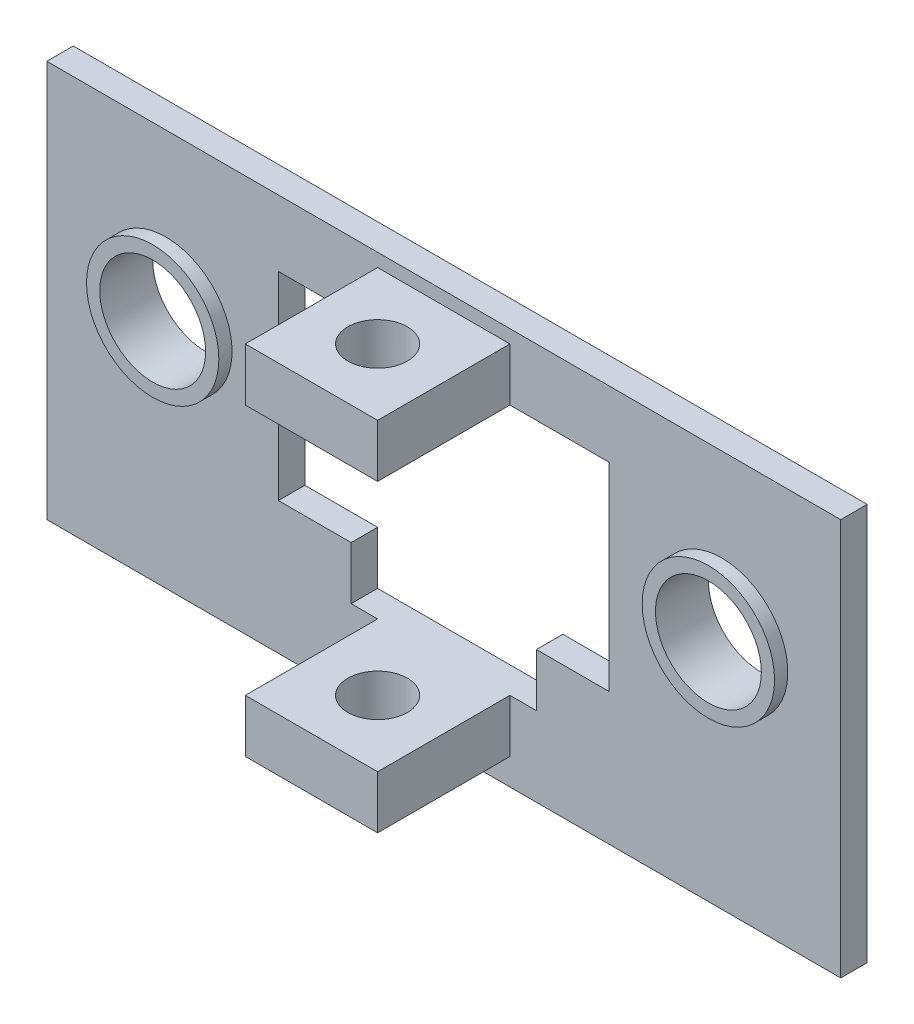
ISO-10303-21;
HEADER;
FILE_DESCRIPTION(('STEP AP214'),'2;1');
FILE_NAME('part.step','',(''),(''),'','','');
FILE_SCHEMA(('AUTOMOTIVE_DESIGN { 1 0 10303 214 1 1 1 1 }'));
ENDSEC;
DATA;
#1=APPLICATION_CONTEXT('core data for automotive mechanical design processes');
#2=APPLICATION_PROTOCOL_DEFINITION('international standard','automotive_design',2000,#1);
#3=PRODUCT_CONTEXT('',#1,'mechanical');
#4=PRODUCT('Part','Part','',(#3));
#5=PRODUCT_RELATED_PRODUCT_CATEGORY('part','',(#4));
#6=PRODUCT_DEFINITION_FORMATION('','',#4);
#7=PRODUCT_DEFINITION_CONTEXT('part definition',#1,'design');
#8=PRODUCT_DEFINITION('design','',#6,#7);
#9=PRODUCT_DEFINITION_SHAPE('','',#8);
#10=(LENGTH_UNIT() NAMED_UNIT(*) SI_UNIT(.MILLI.,.METRE.));
#11=(NAMED_UNIT(*) PLANE_ANGLE_UNIT() SI_UNIT($,.RADIAN.));
#12=(NAMED_UNIT(*) SI_UNIT($,.STERADIAN.) SOLID_ANGLE_UNIT());
#13=UNCERTAINTY_MEASURE_WITH_UNIT(LENGTH_MEASURE(1.E-05),#10,'distance_accuracy_value','');
#14=(GEOMETRIC_REPRESENTATION_CONTEXT(3) GLOBAL_UNCERTAINTY_ASSIGNED_CONTEXT((#13)) GLOBAL_UNIT_ASSIGNED_CONTEXT((#10,
#11,#12)) REPRESENTATION_CONTEXT('',''));
#15=CARTESIAN_POINT('',(0.,0.,0.));
#16=DIRECTION('',(0.,0.,1.));
#17=DIRECTION('',(1.,0.,0.));
#18=AXIS2_PLACEMENT_3D('',#15,#16,#17);
#19=CARTESIAN_POINT('',(12.5,-5.,0.));
#20=DIRECTION('',(0.,-1.,0.));
#21=DIRECTION('',(1.,0.,0.));
#22=AXIS2_PLACEMENT_3D('',#19,#20,#21);
#23=PLANE('',#22);
#24=DIRECTION('',(1.,0.,0.));
#25=VECTOR('',#24,1.);
#26=CARTESIAN_POINT('',(12.5,-5.,2.));
#27=LINE('',#26,#25);
#28=CARTESIAN_POINT('',(-12.5,-5.,2.));
#29=VERTEX_POINT('',#28);
#30=CARTESIAN_POINT('',(-7.,-5.,2.));
#31=VERTEX_POINT('',#30);
#32=EDGE_CURVE('E367',#29,#31,#27,.T.);
#33=ORIENTED_EDGE('',*,*,#32,.T.);
#34=DIRECTION('',(0.,0.,-1.));
#35=VECTOR('',#34,1.);
#36=CARTESIAN_POINT('',(-7.,-5.,0.));
#37=LINE('',#36,#35);
#38=CARTESIAN_POINT('',(-7.,-5.,0.));
#39=VERTEX_POINT('',#38);
#40=EDGE_CURVE('E52',#31,#39,#37,.T.);
#41=ORIENTED_EDGE('',*,*,#40,.T.);
#42=DIRECTION('',(1.,0.,0.));
#43=VECTOR('',#42,1.);
#44=CARTESIAN_POINT('',(12.5,-5.,0.));
#45=LINE('',#44,#43);
#46=CARTESIAN_POINT('',(-12.5,-5.,0.));
#47=VERTEX_POINT('',#46);
#48=EDGE_CURVE('E349',#47,#39,#45,.T.);
#49=ORIENTED_EDGE('',*,*,#48,.F.);
#50=DIRECTION('',(0.,0.,1.));
#51=VECTOR('',#50,1.);
#52=CARTESIAN_POINT('',(-12.5,-5.,0.));
#53=LINE('',#52,#51);
#54=EDGE_CURVE('E383',#47,#29,#53,.T.);
#55=ORIENTED_EDGE('',*,*,#54,.T.);
#56=EDGE_LOOP('',(#33,#41,#49,#55));
#57=FACE_BOUND('',#56,.T.);
#58=ADVANCED_FACE('F43',(#57),#23,.F.);
#59=CARTESIAN_POINT('',(0.,0.,2.));
#60=DIRECTION('',(0.,0.,-1.));
#61=DIRECTION('',(-1.,0.,0.));
#62=AXIS2_PLACEMENT_3D('',#59,#60,#61);
#63=PLANE('',#62);
#64=CARTESIAN_POINT('',(7.,-5.,2.));
#65=VERTEX_POINT('',#64);
#66=CARTESIAN_POINT('',(12.5,-5.,2.));
#67=VERTEX_POINT('',#66);
#68=EDGE_CURVE('E348',#65,#67,#27,.T.);
#69=ORIENTED_EDGE('',*,*,#68,.F.);
#70=DIRECTION('',(0.,1.,0.));
#71=VECTOR('',#70,1.);
#72=CARTESIAN_POINT('',(7.,-5.,2.));
#73=LINE('',#72,#71);
#74=CARTESIAN_POINT('',(7.,-9.,2.));
#75=VERTEX_POINT('',#74);
#76=EDGE_CURVE('E195',#75,#65,#73,.T.);
#77=ORIENTED_EDGE('',*,*,#76,.F.);
#78=DIRECTION('',(1.,0.,0.));
#79=VECTOR('',#78,1.);
#80=CARTESIAN_POINT('',(-7.,-9.,2.));
#81=LINE('',#80,#79);
#82=CARTESIAN_POINT('',(5.,-9.,2.));
#83=VERTEX_POINT('',#82);
#84=EDGE_CURVE('E204',#83,#75,#81,.T.);
#85=ORIENTED_EDGE('',*,*,#84,.F.);
#86=DIRECTION('',(0.,1.,0.));
#87=VECTOR('',#86,1.);
#88=CARTESIAN_POINT('',(5.,-9.,2.));
#89=LINE('',#88,#87);
#90=CARTESIAN_POINT('',(5.,-13.,2.));
#91=VERTEX_POINT('',#90);
#92=EDGE_CURVE('E279',#91,#83,#89,.T.);
#93=ORIENTED_EDGE('',*,*,#92,.F.);
#94=DIRECTION('',(1.,0.,0.));
#95=VECTOR('',#94,1.);
#96=CARTESIAN_POINT('',(-5.,-13.,2.));
#97=LINE('',#96,#95);
#98=CARTESIAN_POINT('',(-5.,-13.,2.));
#99=VERTEX_POINT('',#98);
#100=EDGE_CURVE('E67',#99,#91,#97,.T.);
#101=ORIENTED_EDGE('',*,*,#100,.F.);
#102=DIRECTION('',(0.,-1.,0.));
#103=VECTOR('',#102,1.);
#104=CARTESIAN_POINT('',(-5.,-9.,2.));
#105=LINE('',#104,#103);
#106=CARTESIAN_POINT('',(-5.,-9.,2.));
#107=VERTEX_POINT('',#106);
#108=EDGE_CURVE('E210',#107,#99,#105,.T.);
#109=ORIENTED_EDGE('',*,*,#108,.F.);
#110=CARTESIAN_POINT('',(-7.,-9.,2.));
#111=VERTEX_POINT('',#110);
#112=EDGE_CURVE('E188',#111,#107,#81,.T.);
#113=ORIENTED_EDGE('',*,*,#112,.F.);
#114=DIRECTION('',(0.,-1.,0.));
#115=VECTOR('',#114,1.);
#116=CARTESIAN_POINT('',(-7.,-5.,2.));
#117=LINE('',#116,#115);
#118=EDGE_CURVE('E198',#31,#111,#117,.T.);
#119=ORIENTED_EDGE('',*,*,#118,.F.);
#120=ORIENTED_EDGE('',*,*,#32,.F.);
#121=DIRECTION('',(0.,-1.,0.));
#122=VECTOR('',#121,1.);
#123=CARTESIAN_POINT('',(-12.5,10.,2.));
#124=LINE('',#123,#122);
#125=CARTESIAN_POINT('',(-12.5,10.,2.));
#126=VERTEX_POINT('',#125);
#127=EDGE_CURVE('E379',#126,#29,#124,.T.);
#128=ORIENTED_EDGE('',*,*,#127,.F.);
#129=DIRECTION('',(-1.,0.,0.));
#130=VECTOR('',#129,1.);
#131=CARTESIAN_POINT('',(12.5,10.,2.));
#132=LINE('',#131,#130);
#133=CARTESIAN_POINT('',(-5.,10.,2.));
#134=VERTEX_POINT('',#133);
#135=EDGE_CURVE('E374',#134,#126,#132,.T.);
#136=ORIENTED_EDGE('',*,*,#135,.F.);
#137=DIRECTION('',(0.,-1.,0.));
#138=VECTOR('',#137,1.);
#139=CARTESIAN_POINT('',(-5.,14.,2.));
#140=LINE('',#139,#138);
#141=CARTESIAN_POINT('',(-5.,14.,2.));
#142=VERTEX_POINT('',#141);
#143=EDGE_CURVE('E59',#142,#134,#140,.T.);
#144=ORIENTED_EDGE('',*,*,#143,.F.);
#145=DIRECTION('',(-1.,0.,0.));
#146=VECTOR('',#145,1.);
#147=CARTESIAN_POINT('',(-5.,14.,2.));
#148=LINE('',#147,#146);
#149=CARTESIAN_POINT('',(5.,14.,2.));
#150=VERTEX_POINT('',#149);
#151=EDGE_CURVE('E254',#150,#142,#148,.T.);
#152=ORIENTED_EDGE('',*,*,#151,.F.);
#153=DIRECTION('',(0.,1.,0.));
#154=VECTOR('',#153,1.);
#155=CARTESIAN_POINT('',(5.,14.,2.));
#156=LINE('',#155,#154);
#157=CARTESIAN_POINT('',(5.,10.,2.));
#158=VERTEX_POINT('',#157);
#159=EDGE_CURVE('E257',#158,#150,#156,.T.);
#160=ORIENTED_EDGE('',*,*,#159,.F.);
#161=CARTESIAN_POINT('',(12.5,10.,2.));
#162=VERTEX_POINT('',#161);
#163=EDGE_CURVE('E375',#162,#158,#132,.T.);
#164=ORIENTED_EDGE('',*,*,#163,.F.);
#165=DIRECTION('',(0.,1.,0.));
#166=VECTOR('',#165,1.);
#167=CARTESIAN_POINT('',(12.5,10.,2.));
#168=LINE('',#167,#166);
#169=EDGE_CURVE('E370',#67,#162,#168,.T.);
#170=ORIENTED_EDGE('',*,*,#169,.F.);
#171=EDGE_LOOP('',(#69,#77,#85,#93,#101,#109,#113,#119,#120,#128,#136,#144,#152,#160,#164,#170));
#172=FACE_BOUND('',#171,.T.);
#173=CARTESIAN_POINT('',(-21.,3.,2.));
#174=DIRECTION('',(0.,0.,-1.));
#175=DIRECTION('',(-1.,0.,0.));
#176=AXIS2_PLACEMENT_3D('',#173,#174,#175);
#177=CIRCLE('',#176,5.);
#178=CARTESIAN_POINT('',(-26.,3.,2.));
#179=VERTEX_POINT('',#178);
#180=EDGE_CURVE('E438',#179,#179,#177,.F.);
#181=ORIENTED_EDGE('',*,*,#180,.F.);
#182=EDGE_LOOP('',(#181));
#183=FACE_BOUND('',#182,.T.);
#184=DIRECTION('',(0.,1.,0.));
#185=VECTOR('',#184,1.);
#186=CARTESIAN_POINT('',(30.,-15.,2.));
#187=LINE('',#186,#185);
#188=CARTESIAN_POINT('',(30.,-15.,2.));
#189=VERTEX_POINT('',#188);
#190=CARTESIAN_POINT('',(30.,15.,2.));
#191=VERTEX_POINT('',#190);
#192=EDGE_CURVE('E397',#189,#191,#187,.T.);
#193=ORIENTED_EDGE('',*,*,#192,.T.);
#194=DIRECTION('',(-1.,0.,0.));
#195=VECTOR('',#194,1.);
#196=CARTESIAN_POINT('',(-30.,15.,2.));
#197=LINE('',#196,#195);
#198=CARTESIAN_POINT('',(-30.,15.,2.));
#199=VERTEX_POINT('',#198);
#200=EDGE_CURVE('E401',#191,#199,#197,.T.);
#201=ORIENTED_EDGE('',*,*,#200,.T.);
#202=DIRECTION('',(0.,-1.,0.));
#203=VECTOR('',#202,1.);
#204=CARTESIAN_POINT('',(-30.,-15.,2.));
#205=LINE('',#204,#203);
#206=CARTESIAN_POINT('',(-30.,-15.,2.));
#207=VERTEX_POINT('',#206);
#208=EDGE_CURVE('E405',#199,#207,#205,.T.);
#209=ORIENTED_EDGE('',*,*,#208,.T.);
#210=DIRECTION('',(1.,0.,0.));
#211=VECTOR('',#210,1.);
#212=CARTESIAN_POINT('',(-30.,-15.,2.));
#213=LINE('',#212,#211);
#214=EDGE_CURVE('E408',#207,#189,#213,.T.);
#215=ORIENTED_EDGE('',*,*,#214,.T.);
#216=EDGE_LOOP('',(#193,#201,#209,#215));
#217=FACE_BOUND('',#216,.T.);
#218=CARTESIAN_POINT('',(21.,3.,2.));
#219=DIRECTION('',(0.,0.,-1.));
#220=DIRECTION('',(-1.,0.,0.));
#221=AXIS2_PLACEMENT_3D('',#218,#219,#220);
#222=CIRCLE('',#221,5.);
#223=CARTESIAN_POINT('',(16.,3.,2.));
#224=VERTEX_POINT('',#223);
#225=EDGE_CURVE('E442',#224,#224,#222,.F.);
#226=ORIENTED_EDGE('',*,*,#225,.F.);
#227=EDGE_LOOP('',(#226));
#228=FACE_BOUND('',#227,.T.);
#229=ADVANCED_FACE('F207',(#172,#183,#217,#228),#63,.F.);
#230=CARTESIAN_POINT('',(0.,0.,0.));
#231=DIRECTION('',(0.,0.,-1.));
#232=DIRECTION('',(-1.,0.,0.));
#233=AXIS2_PLACEMENT_3D('',#230,#231,#232);
#234=PLANE('',#233);
#235=DIRECTION('',(0.,1.,0.));
#236=VECTOR('',#235,1.);
#237=CARTESIAN_POINT('',(-7.,0.,0.));
#238=LINE('',#237,#236);
#239=CARTESIAN_POINT('',(-7.,-9.,0.));
#240=VERTEX_POINT('',#239);
#241=EDGE_CURVE('E224',#240,#39,#238,.T.);
#242=ORIENTED_EDGE('',*,*,#241,.F.);
#243=DIRECTION('',(-1.,0.,0.));
#244=VECTOR('',#243,1.);
#245=CARTESIAN_POINT('',(0.,-9.,0.));
#246=LINE('',#245,#244);
#247=CARTESIAN_POINT('',(7.,-9.,0.));
#248=VERTEX_POINT('',#247);
#249=EDGE_CURVE('E11',#248,#240,#246,.T.);
#250=ORIENTED_EDGE('',*,*,#249,.F.);
#251=DIRECTION('',(0.,-1.,0.));
#252=VECTOR('',#251,1.);
#253=CARTESIAN_POINT('',(7.,0.,0.));
#254=LINE('',#253,#252);
#255=CARTESIAN_POINT('',(7.,-5.,0.));
#256=VERTEX_POINT('',#255);
#257=EDGE_CURVE('E220',#256,#248,#254,.T.);
#258=ORIENTED_EDGE('',*,*,#257,.F.);
#259=CARTESIAN_POINT('',(12.5,-5.,0.));
#260=VERTEX_POINT('',#259);
#261=EDGE_CURVE('E354',#256,#260,#45,.T.);
#262=ORIENTED_EDGE('',*,*,#261,.T.);
#263=DIRECTION('',(0.,1.,0.));
#264=VECTOR('',#263,1.);
#265=CARTESIAN_POINT('',(12.5,10.,0.));
#266=LINE('',#265,#264);
#267=CARTESIAN_POINT('',(12.5,10.,0.));
#268=VERTEX_POINT('',#267);
#269=EDGE_CURVE('E353',#260,#268,#266,.T.);
#270=ORIENTED_EDGE('',*,*,#269,.T.);
#271=DIRECTION('',(-1.,0.,0.));
#272=VECTOR('',#271,1.);
#273=CARTESIAN_POINT('',(12.5,10.,0.));
#274=LINE('',#273,#272);
#275=CARTESIAN_POINT('',(-12.5,10.,0.));
#276=VERTEX_POINT('',#275);
#277=EDGE_CURVE('E358',#268,#276,#274,.T.);
#278=ORIENTED_EDGE('',*,*,#277,.T.);
#279=DIRECTION('',(0.,-1.,0.));
#280=VECTOR('',#279,1.);
#281=CARTESIAN_POINT('',(-12.5,10.,0.));
#282=LINE('',#281,#280);
#283=EDGE_CURVE('E362',#276,#47,#282,.T.);
#284=ORIENTED_EDGE('',*,*,#283,.T.);
#285=ORIENTED_EDGE('',*,*,#48,.T.);
#286=EDGE_LOOP('',(#242,#250,#258,#262,#270,#278,#284,#285));
#287=FACE_BOUND('',#286,.T.);
#288=CARTESIAN_POINT('',(21.,3.,0.));
#289=DIRECTION('',(0.,0.,-1.));
#290=DIRECTION('',(-1.,0.,0.));
#291=AXIS2_PLACEMENT_3D('',#288,#289,#290);
#292=CIRCLE('',#291,5.);
#293=CARTESIAN_POINT('',(16.,3.,0.));
#294=VERTEX_POINT('',#293);
#295=EDGE_CURVE('E324',#294,#294,#292,.T.);
#296=ORIENTED_EDGE('',*,*,#295,.F.);
#297=EDGE_LOOP('',(#296));
#298=FACE_BOUND('',#297,.T.);
#299=DIRECTION('',(0.,1.,0.));
#300=VECTOR('',#299,1.);
#301=CARTESIAN_POINT('',(30.,-15.,0.));
#302=LINE('',#301,#300);
#303=CARTESIAN_POINT('',(30.,-15.,0.));
#304=VERTEX_POINT('',#303);
#305=CARTESIAN_POINT('',(30.,15.,0.));
#306=VERTEX_POINT('',#305);
#307=EDGE_CURVE('E386',#304,#306,#302,.T.);
#308=ORIENTED_EDGE('',*,*,#307,.F.);
#309=DIRECTION('',(1.,0.,0.));
#310=VECTOR('',#309,1.);
#311=CARTESIAN_POINT('',(-30.,-15.,0.));
#312=LINE('',#311,#310);
#313=CARTESIAN_POINT('',(-30.,-15.,0.));
#314=VERTEX_POINT('',#313);
#315=EDGE_CURVE('E402',#314,#304,#312,.T.);
#316=ORIENTED_EDGE('',*,*,#315,.F.);
#317=DIRECTION('',(0.,-1.,0.));
#318=VECTOR('',#317,1.);
#319=CARTESIAN_POINT('',(-30.,-15.,0.));
#320=LINE('',#319,#318);
#321=CARTESIAN_POINT('',(-30.,15.,0.));
#322=VERTEX_POINT('',#321);
#323=EDGE_CURVE('E418',#322,#314,#320,.T.);
#324=ORIENTED_EDGE('',*,*,#323,.F.);
#325=DIRECTION('',(-1.,0.,0.));
#326=VECTOR('',#325,1.);
#327=CARTESIAN_POINT('',(-30.,15.,0.));
#328=LINE('',#327,#326);
#329=EDGE_CURVE('E415',#306,#322,#328,.T.);
#330=ORIENTED_EDGE('',*,*,#329,.F.);
#331=EDGE_LOOP('',(#308,#316,#324,#330));
#332=FACE_BOUND('',#331,.T.);
#333=CARTESIAN_POINT('',(-21.,3.,0.));
#334=DIRECTION('',(0.,0.,-1.));
#335=DIRECTION('',(-1.,0.,0.));
#336=AXIS2_PLACEMENT_3D('',#333,#334,#335);
#337=CIRCLE('',#336,5.);
#338=CARTESIAN_POINT('',(-26.,3.,0.));
#339=VERTEX_POINT('',#338);
#340=EDGE_CURVE('E309',#339,#339,#337,.T.);
#341=ORIENTED_EDGE('',*,*,#340,.F.);
#342=EDGE_LOOP('',(#341));
#343=FACE_BOUND('',#342,.T.);
#344=ADVANCED_FACE('F456',(#287,#298,#332,#343),#234,.T.);
#345=CARTESIAN_POINT('',(30.,-15.,2.));
#346=DIRECTION('',(-1.,0.,0.));
#347=DIRECTION('',(0.,0.,1.));
#348=AXIS2_PLACEMENT_3D('',#345,#346,#347);
#349=PLANE('',#348);
#350=ORIENTED_EDGE('',*,*,#307,.T.);
#351=DIRECTION('',(0.,0.,-1.));
#352=VECTOR('',#351,1.);
#353=CARTESIAN_POINT('',(30.,15.,2.));
#354=LINE('',#353,#352);
#355=EDGE_CURVE('E434',#191,#306,#354,.T.);
#356=ORIENTED_EDGE('',*,*,#355,.F.);
#357=ORIENTED_EDGE('',*,*,#192,.F.);
#358=DIRECTION('',(0.,0.,-1.));
#359=VECTOR('',#358,1.);
#360=CARTESIAN_POINT('',(30.,-15.,2.));
#361=LINE('',#360,#359);
#362=EDGE_CURVE('E411',#189,#304,#361,.T.);
#363=ORIENTED_EDGE('',*,*,#362,.T.);
#364=EDGE_LOOP('',(#350,#356,#357,#363));
#365=FACE_BOUND('',#364,.T.);
#366=ADVANCED_FACE('F45',(#365),#349,.F.);
#367=CARTESIAN_POINT('',(-30.,15.,2.));
#368=DIRECTION('',(0.,-1.,0.));
#369=DIRECTION('',(0.,0.,-1.));
#370=AXIS2_PLACEMENT_3D('',#367,#368,#369);
#371=PLANE('',#370);
#372=ORIENTED_EDGE('',*,*,#329,.T.);
#373=DIRECTION('',(0.,0.,-1.));
#374=VECTOR('',#373,1.);
#375=CARTESIAN_POINT('',(-30.,15.,2.));
#376=LINE('',#375,#374);
#377=EDGE_CURVE('E430',#199,#322,#376,.T.);
#378=ORIENTED_EDGE('',*,*,#377,.F.);
#379=ORIENTED_EDGE('',*,*,#200,.F.);
#380=ORIENTED_EDGE('',*,*,#355,.T.);
#381=EDGE_LOOP('',(#372,#378,#379,#380));
#382=FACE_BOUND('',#381,.T.);
#383=ADVANCED_FACE('F544',(#382),#371,.F.);
#384=CARTESIAN_POINT('',(-30.,-15.,2.));
#385=DIRECTION('',(1.,0.,0.));
#386=DIRECTION('',(0.,0.,-1.));
#387=AXIS2_PLACEMENT_3D('',#384,#385,#386);
#388=PLANE('',#387);
#389=ORIENTED_EDGE('',*,*,#323,.T.);
#390=DIRECTION('',(0.,0.,-1.));
#391=VECTOR('',#390,1.);
#392=CARTESIAN_POINT('',(-30.,-15.,2.));
#393=LINE('',#392,#391);
#394=EDGE_CURVE('E426',#207,#314,#393,.T.);
#395=ORIENTED_EDGE('',*,*,#394,.F.);
#396=ORIENTED_EDGE('',*,*,#208,.F.);
#397=ORIENTED_EDGE('',*,*,#377,.T.);
#398=EDGE_LOOP('',(#389,#395,#396,#397));
#399=FACE_BOUND('',#398,.T.);
#400=ADVANCED_FACE('F541',(#399),#388,.F.);
#401=CARTESIAN_POINT('',(-30.,-15.,2.));
#402=DIRECTION('',(0.,1.,0.));
#403=DIRECTION('',(0.,0.,1.));
#404=AXIS2_PLACEMENT_3D('',#401,#402,#403);
#405=PLANE('',#404);
#406=ORIENTED_EDGE('',*,*,#315,.T.);
#407=ORIENTED_EDGE('',*,*,#362,.F.);
#408=ORIENTED_EDGE('',*,*,#214,.F.);
#409=ORIENTED_EDGE('',*,*,#394,.T.);
#410=EDGE_LOOP('',(#406,#407,#408,#409));
#411=FACE_BOUND('',#410,.T.);
#412=ADVANCED_FACE('F532',(#411),#405,.F.);
#413=CARTESIAN_POINT('',(21.,3.,-11.));
#414=DIRECTION('',(0.,0.,1.));
#415=DIRECTION('',(1.,0.,0.));
#416=AXIS2_PLACEMENT_3D('',#413,#414,#415);
#417=CYLINDRICAL_SURFACE('',#416,4.);
#418=CARTESIAN_POINT('',(21.,3.,3.));
#419=DIRECTION('',(0.,0.,1.));
#420=DIRECTION('',(1.,0.,0.));
#421=AXIS2_PLACEMENT_3D('',#418,#419,#420);
#422=CIRCLE('',#421,4.);
#423=CARTESIAN_POINT('',(25.,3.,3.));
#424=VERTEX_POINT('',#423);
#425=EDGE_CURVE('E336',#424,#424,#422,.T.);
#426=ORIENTED_EDGE('',*,*,#425,.T.);
#427=EDGE_LOOP('',(#426));
#428=FACE_BOUND('',#427,.T.);
#429=CARTESIAN_POINT('',(21.,3.,-1.));
#430=DIRECTION('',(0.,0.,-1.));
#431=DIRECTION('',(-1.,0.,0.));
#432=AXIS2_PLACEMENT_3D('',#429,#430,#431);
#433=CIRCLE('',#432,4.);
#434=CARTESIAN_POINT('',(17.,3.,-1.));
#435=VERTEX_POINT('',#434);
#436=EDGE_CURVE('E320',#435,#435,#433,.T.);
#437=ORIENTED_EDGE('',*,*,#436,.T.);
#438=EDGE_LOOP('',(#437));
#439=FACE_BOUND('',#438,.T.);
#440=ADVANCED_FACE('F527',(#428,#439),#417,.F.);
#441=CARTESIAN_POINT('',(-21.,3.,-11.));
#442=DIRECTION('',(0.,0.,1.));
#443=DIRECTION('',(1.,0.,0.));
#444=AXIS2_PLACEMENT_3D('',#441,#442,#443);
#445=CYLINDRICAL_SURFACE('',#444,4.);
#446=CARTESIAN_POINT('',(-21.,3.,3.));
#447=DIRECTION('',(0.,0.,1.));
#448=DIRECTION('',(1.,0.,0.));
#449=AXIS2_PLACEMENT_3D('',#446,#447,#448);
#450=CIRCLE('',#449,4.);
#451=CARTESIAN_POINT('',(-17.,3.,3.));
#452=VERTEX_POINT('',#451);
#453=EDGE_CURVE('E340',#452,#452,#450,.T.);
#454=ORIENTED_EDGE('',*,*,#453,.T.);
#455=EDGE_LOOP('',(#454));
#456=FACE_BOUND('',#455,.T.);
#457=CARTESIAN_POINT('',(-21.,3.,-1.));
#458=DIRECTION('',(0.,0.,-1.));
#459=DIRECTION('',(-1.,0.,0.));
#460=AXIS2_PLACEMENT_3D('',#457,#458,#459);
#461=CIRCLE('',#460,4.);
#462=CARTESIAN_POINT('',(-25.,3.,-1.));
#463=VERTEX_POINT('',#462);
#464=EDGE_CURVE('E313',#463,#463,#461,.T.);
#465=ORIENTED_EDGE('',*,*,#464,.T.);
#466=EDGE_LOOP('',(#465));
#467=FACE_BOUND('',#466,.T.);
#468=ADVANCED_FACE('F521',(#456,#467),#445,.F.);
#469=ORIENTED_EDGE('',*,*,#261,.F.);
#470=DIRECTION('',(0.,0.,1.));
#471=VECTOR('',#470,1.);
#472=CARTESIAN_POINT('',(7.,-5.,0.));
#473=LINE('',#472,#471);
#474=EDGE_CURVE('E446',#256,#65,#473,.T.);
#475=ORIENTED_EDGE('',*,*,#474,.T.);
#476=ORIENTED_EDGE('',*,*,#68,.T.);
#477=DIRECTION('',(0.,0.,1.));
#478=VECTOR('',#477,1.);
#479=CARTESIAN_POINT('',(12.5,-5.,0.));
#480=LINE('',#479,#478);
#481=EDGE_CURVE('E366',#260,#67,#480,.T.);
#482=ORIENTED_EDGE('',*,*,#481,.F.);
#483=EDGE_LOOP('',(#469,#475,#476,#482));
#484=FACE_BOUND('',#483,.T.);
#485=ADVANCED_FACE('F470',(#484),#23,.F.);
#486=CARTESIAN_POINT('',(-12.5,10.,0.));
#487=DIRECTION('',(-1.,0.,0.));
#488=DIRECTION('',(0.,-1.,0.));
#489=AXIS2_PLACEMENT_3D('',#486,#487,#488);
#490=PLANE('',#489);
#491=ORIENTED_EDGE('',*,*,#127,.T.);
#492=ORIENTED_EDGE('',*,*,#54,.F.);
#493=ORIENTED_EDGE('',*,*,#283,.F.);
#494=DIRECTION('',(0.,0.,1.));
#495=VECTOR('',#494,1.);
#496=CARTESIAN_POINT('',(-12.5,10.,0.));
#497=LINE('',#496,#495);
#498=EDGE_CURVE('E387',#276,#126,#497,.T.);
#499=ORIENTED_EDGE('',*,*,#498,.T.);
#500=EDGE_LOOP('',(#491,#492,#493,#499));
#501=FACE_BOUND('',#500,.T.);
#502=ADVANCED_FACE('F460',(#501),#490,.F.);
#503=CARTESIAN_POINT('',(12.5,10.,0.));
#504=DIRECTION('',(0.,1.,0.));
#505=DIRECTION('',(-1.,0.,0.));
#506=AXIS2_PLACEMENT_3D('',#503,#504,#505);
#507=PLANE('',#506);
#508=CARTESIAN_POINT('',(0.,10.,7.));
#509=DIRECTION('',(0.,-1.,0.));
#510=DIRECTION('',(1.,0.,0.));
#511=AXIS2_PLACEMENT_3D('',#508,#509,#510);
#512=CIRCLE('',#511,2.25);
#513=CARTESIAN_POINT('',(2.25,10.,7.));
#514=VERTEX_POINT('',#513);
#515=EDGE_CURVE('E235',#514,#514,#512,.T.);
#516=ORIENTED_EDGE('',*,*,#515,.F.);
#517=EDGE_LOOP('',(#516));
#518=FACE_BOUND('',#517,.T.);
#519=ORIENTED_EDGE('',*,*,#163,.T.);
#520=DIRECTION('',(0.,0.,-1.));
#521=VECTOR('',#520,1.);
#522=CARTESIAN_POINT('',(5.,10.,12.));
#523=LINE('',#522,#521);
#524=CARTESIAN_POINT('',(5.,10.,12.));
#525=VERTEX_POINT('',#524);
#526=EDGE_CURVE('E243',#525,#158,#523,.T.);
#527=ORIENTED_EDGE('',*,*,#526,.F.);
#528=DIRECTION('',(1.,0.,0.));
#529=VECTOR('',#528,1.);
#530=CARTESIAN_POINT('',(-5.,10.,12.));
#531=LINE('',#530,#529);
#532=CARTESIAN_POINT('',(-5.,10.,12.));
#533=VERTEX_POINT('',#532);
#534=EDGE_CURVE('E268',#533,#525,#531,.T.);
#535=ORIENTED_EDGE('',*,*,#534,.F.);
#536=DIRECTION('',(0.,0.,-1.));
#537=VECTOR('',#536,1.);
#538=CARTESIAN_POINT('',(-5.,10.,12.));
#539=LINE('',#538,#537);
#540=EDGE_CURVE('E240',#533,#134,#539,.T.);
#541=ORIENTED_EDGE('',*,*,#540,.T.);
#542=ORIENTED_EDGE('',*,*,#135,.T.);
#543=ORIENTED_EDGE('',*,*,#498,.F.);
#544=ORIENTED_EDGE('',*,*,#277,.F.);
#545=DIRECTION('',(0.,0.,1.));
#546=VECTOR('',#545,1.);
#547=CARTESIAN_POINT('',(12.5,10.,0.));
#548=LINE('',#547,#546);
#549=EDGE_CURVE('E391',#268,#162,#548,.T.);
#550=ORIENTED_EDGE('',*,*,#549,.T.);
#551=EDGE_LOOP('',(#519,#527,#535,#541,#542,#543,#544,#550));
#552=FACE_BOUND('',#551,.T.);
#553=ADVANCED_FACE('F480',(#518,#552),#507,.F.);
#554=CARTESIAN_POINT('',(12.5,10.,0.));
#555=DIRECTION('',(1.,0.,0.));
#556=DIRECTION('',(0.,1.,0.));
#557=AXIS2_PLACEMENT_3D('',#554,#555,#556);
#558=PLANE('',#557);
#559=ORIENTED_EDGE('',*,*,#169,.T.);
#560=ORIENTED_EDGE('',*,*,#549,.F.);
#561=ORIENTED_EDGE('',*,*,#269,.F.);
#562=ORIENTED_EDGE('',*,*,#481,.T.);
#563=EDGE_LOOP('',(#559,#560,#561,#562));
#564=FACE_BOUND('',#563,.T.);
#565=ADVANCED_FACE('F475',(#564),#558,.F.);
#566=CARTESIAN_POINT('',(-21.,3.,3.));
#567=DIRECTION('',(0.,0.,1.));
#568=DIRECTION('',(1.,0.,0.));
#569=AXIS2_PLACEMENT_3D('',#566,#567,#568);
#570=PLANE('',#569);
#571=CARTESIAN_POINT('',(-21.,3.,3.));
#572=DIRECTION('',(0.,0.,1.));
#573=DIRECTION('',(1.,0.,0.));
#574=AXIS2_PLACEMENT_3D('',#571,#572,#573);
#575=CIRCLE('',#574,5.);
#576=CARTESIAN_POINT('',(-16.,3.,3.));
#577=VERTEX_POINT('',#576);
#578=EDGE_CURVE('E344',#577,#577,#575,.T.);
#579=ORIENTED_EDGE('',*,*,#578,.T.);
#580=EDGE_LOOP('',(#579));
#581=FACE_BOUND('',#580,.T.);
#582=ORIENTED_EDGE('',*,*,#453,.F.);
#583=EDGE_LOOP('',(#582));
#584=FACE_BOUND('',#583,.T.);
#585=ADVANCED_FACE('F587',(#581,#584),#570,.T.);
#586=CARTESIAN_POINT('',(-21.,3.,3.));
#587=DIRECTION('',(0.,0.,-1.));
#588=DIRECTION('',(-1.,0.,0.));
#589=AXIS2_PLACEMENT_3D('',#586,#587,#588);
#590=CYLINDRICAL_SURFACE('',#589,5.);
#591=ORIENTED_EDGE('',*,*,#578,.F.);
#592=EDGE_LOOP('',(#591));
#593=FACE_BOUND('',#592,.T.);
#594=ORIENTED_EDGE('',*,*,#180,.T.);
#595=EDGE_LOOP('',(#594));
#596=FACE_BOUND('',#595,.T.);
#597=ADVANCED_FACE('F581',(#593,#596),#590,.T.);
#598=CARTESIAN_POINT('',(21.,3.,3.));
#599=DIRECTION('',(0.,0.,1.));
#600=DIRECTION('',(1.,0.,0.));
#601=AXIS2_PLACEMENT_3D('',#598,#599,#600);
#602=PLANE('',#601);
#603=CARTESIAN_POINT('',(21.,3.,3.));
#604=DIRECTION('',(0.,0.,1.));
#605=DIRECTION('',(1.,0.,0.));
#606=AXIS2_PLACEMENT_3D('',#603,#604,#605);
#607=CIRCLE('',#606,5.);
#608=CARTESIAN_POINT('',(26.,3.,3.));
#609=VERTEX_POINT('',#608);
#610=EDGE_CURVE('E329',#609,#609,#607,.T.);
#611=ORIENTED_EDGE('',*,*,#610,.T.);
#612=EDGE_LOOP('',(#611));
#613=FACE_BOUND('',#612,.T.);
#614=ORIENTED_EDGE('',*,*,#425,.F.);
#615=EDGE_LOOP('',(#614));
#616=FACE_BOUND('',#615,.T.);
#617=ADVANCED_FACE('F571',(#613,#616),#602,.T.);
#618=CARTESIAN_POINT('',(21.,3.,3.));
#619=DIRECTION('',(0.,0.,-1.));
#620=DIRECTION('',(-1.,0.,0.));
#621=AXIS2_PLACEMENT_3D('',#618,#619,#620);
#622=CYLINDRICAL_SURFACE('',#621,5.);
#623=ORIENTED_EDGE('',*,*,#610,.F.);
#624=EDGE_LOOP('',(#623));
#625=FACE_BOUND('',#624,.T.);
#626=ORIENTED_EDGE('',*,*,#225,.T.);
#627=EDGE_LOOP('',(#626));
#628=FACE_BOUND('',#627,.T.);
#629=ADVANCED_FACE('F568',(#625,#628),#622,.T.);
#630=CARTESIAN_POINT('',(21.,3.,-1.));
#631=DIRECTION('',(0.,0.,-1.));
#632=DIRECTION('',(-1.,0.,0.));
#633=AXIS2_PLACEMENT_3D('',#630,#631,#632);
#634=PLANE('',#633);
#635=CARTESIAN_POINT('',(21.,3.,-1.));
#636=DIRECTION('',(0.,0.,-1.));
#637=DIRECTION('',(-1.,0.,0.));
#638=AXIS2_PLACEMENT_3D('',#635,#636,#637);
#639=CIRCLE('',#638,5.);
#640=CARTESIAN_POINT('',(16.,3.,-1.));
#641=VERTEX_POINT('',#640);
#642=EDGE_CURVE('E325',#641,#641,#639,.T.);
#643=ORIENTED_EDGE('',*,*,#642,.T.);
#644=EDGE_LOOP('',(#643));
#645=FACE_BOUND('',#644,.T.);
#646=ORIENTED_EDGE('',*,*,#436,.F.);
#647=EDGE_LOOP('',(#646));
#648=FACE_BOUND('',#647,.T.);
#649=ADVANCED_FACE('F570',(#645,#648),#634,.T.);
#650=CARTESIAN_POINT('',(21.,3.,-1.));
#651=DIRECTION('',(0.,0.,1.));
#652=DIRECTION('',(1.,0.,0.));
#653=AXIS2_PLACEMENT_3D('',#650,#651,#652);
#654=CYLINDRICAL_SURFACE('',#653,5.);
#655=ORIENTED_EDGE('',*,*,#642,.F.);
#656=EDGE_LOOP('',(#655));
#657=FACE_BOUND('',#656,.T.);
#658=ORIENTED_EDGE('',*,*,#295,.T.);
#659=EDGE_LOOP('',(#658));
#660=FACE_BOUND('',#659,.T.);
#661=ADVANCED_FACE('F578',(#657,#660),#654,.T.);
#662=CARTESIAN_POINT('',(-21.,3.,-1.));
#663=DIRECTION('',(0.,0.,-1.));
#664=DIRECTION('',(-1.,0.,0.));
#665=AXIS2_PLACEMENT_3D('',#662,#663,#664);
#666=PLANE('',#665);
#667=CARTESIAN_POINT('',(-21.,3.,-1.));
#668=DIRECTION('',(0.,0.,-1.));
#669=DIRECTION('',(-1.,0.,0.));
#670=AXIS2_PLACEMENT_3D('',#667,#668,#669);
#671=CIRCLE('',#670,5.);
#672=CARTESIAN_POINT('',(-26.,3.,-1.));
#673=VERTEX_POINT('',#672);
#674=EDGE_CURVE('E308',#673,#673,#671,.T.);
#675=ORIENTED_EDGE('',*,*,#674,.T.);
#676=EDGE_LOOP('',(#675));
#677=FACE_BOUND('',#676,.T.);
#678=ORIENTED_EDGE('',*,*,#464,.F.);
#679=EDGE_LOOP('',(#678));
#680=FACE_BOUND('',#679,.T.);
#681=ADVANCED_FACE('F649',(#677,#680),#666,.T.);
#682=CARTESIAN_POINT('',(-21.,3.,-1.));
#683=DIRECTION('',(0.,0.,1.));
#684=DIRECTION('',(1.,0.,0.));
#685=AXIS2_PLACEMENT_3D('',#682,#683,#684);
#686=CYLINDRICAL_SURFACE('',#685,5.);
#687=ORIENTED_EDGE('',*,*,#674,.F.);
#688=EDGE_LOOP('',(#687));
#689=FACE_BOUND('',#688,.T.);
#690=ORIENTED_EDGE('',*,*,#340,.T.);
#691=EDGE_LOOP('',(#690));
#692=FACE_BOUND('',#691,.T.);
#693=ADVANCED_FACE('F659',(#689,#692),#686,.T.);
#694=CARTESIAN_POINT('',(-5.,-9.,12.));
#695=DIRECTION('',(1.,0.,0.));
#696=DIRECTION('',(0.,1.,0.));
#697=AXIS2_PLACEMENT_3D('',#694,#695,#696);
#698=PLANE('',#697);
#699=ORIENTED_EDGE('',*,*,#108,.T.);
#700=DIRECTION('',(0.,0.,-1.));
#701=VECTOR('',#700,1.);
#702=CARTESIAN_POINT('',(-5.,-13.,12.));
#703=LINE('',#702,#701);
#704=CARTESIAN_POINT('',(-5.,-13.,12.));
#705=VERTEX_POINT('',#704);
#706=EDGE_CURVE('E305',#705,#99,#703,.T.);
#707=ORIENTED_EDGE('',*,*,#706,.F.);
#708=DIRECTION('',(0.,-1.,0.));
#709=VECTOR('',#708,1.);
#710=CARTESIAN_POINT('',(-5.,-9.,12.));
#711=LINE('',#710,#709);
#712=CARTESIAN_POINT('',(-5.,-9.,12.));
#713=VERTEX_POINT('',#712);
#714=EDGE_CURVE('E274',#713,#705,#711,.T.);
#715=ORIENTED_EDGE('',*,*,#714,.F.);
#716=DIRECTION('',(0.,0.,-1.));
#717=VECTOR('',#716,1.);
#718=CARTESIAN_POINT('',(-5.,-9.,12.));
#719=LINE('',#718,#717);
#720=EDGE_CURVE('E288',#713,#107,#719,.T.);
#721=ORIENTED_EDGE('',*,*,#720,.T.);
#722=EDGE_LOOP('',(#699,#707,#715,#721));
#723=FACE_BOUND('',#722,.T.);
#724=ADVANCED_FACE('F497',(#723),#698,.F.);
#725=CARTESIAN_POINT('',(-5.,-13.,12.));
#726=DIRECTION('',(0.,1.,0.));
#727=DIRECTION('',(0.,0.,1.));
#728=AXIS2_PLACEMENT_3D('',#725,#726,#727);
#729=PLANE('',#728);
#730=CARTESIAN_POINT('',(0.,-13.,7.));
#731=DIRECTION('',(0.,-1.,0.));
#732=DIRECTION('',(0.,0.,-1.));
#733=AXIS2_PLACEMENT_3D('',#730,#731,#732);
#734=CIRCLE('',#733,2.25);
#735=CARTESIAN_POINT('',(0.,-13.,4.75));
#736=VERTEX_POINT('',#735);
#737=EDGE_CURVE('E227',#736,#736,#734,.T.);
#738=ORIENTED_EDGE('',*,*,#737,.F.);
#739=EDGE_LOOP('',(#738));
#740=FACE_BOUND('',#739,.T.);
#741=ORIENTED_EDGE('',*,*,#100,.T.);
#742=DIRECTION('',(0.,0.,-1.));
#743=VECTOR('',#742,1.);
#744=CARTESIAN_POINT('',(5.,-13.,12.));
#745=LINE('',#744,#743);
#746=CARTESIAN_POINT('',(5.,-13.,12.));
#747=VERTEX_POINT('',#746);
#748=EDGE_CURVE('E301',#747,#91,#745,.T.);
#749=ORIENTED_EDGE('',*,*,#748,.F.);
#750=DIRECTION('',(1.,0.,0.));
#751=VECTOR('',#750,1.);
#752=CARTESIAN_POINT('',(-5.,-13.,12.));
#753=LINE('',#752,#751);
#754=EDGE_CURVE('E278',#705,#747,#753,.T.);
#755=ORIENTED_EDGE('',*,*,#754,.F.);
#756=ORIENTED_EDGE('',*,*,#706,.T.);
#757=EDGE_LOOP('',(#741,#749,#755,#756));
#758=FACE_BOUND('',#757,.T.);
#759=ADVANCED_FACE('F493',(#740,#758),#729,.F.);
#760=CARTESIAN_POINT('',(5.,-9.,12.));
#761=DIRECTION('',(-1.,0.,0.));
#762=DIRECTION('',(0.,-1.,0.));
#763=AXIS2_PLACEMENT_3D('',#760,#761,#762);
#764=PLANE('',#763);
#765=ORIENTED_EDGE('',*,*,#92,.T.);
#766=DIRECTION('',(0.,0.,-1.));
#767=VECTOR('',#766,1.);
#768=CARTESIAN_POINT('',(5.,-9.,12.));
#769=LINE('',#768,#767);
#770=CARTESIAN_POINT('',(5.,-9.,12.));
#771=VERTEX_POINT('',#770);
#772=EDGE_CURVE('E298',#771,#83,#769,.T.);
#773=ORIENTED_EDGE('',*,*,#772,.F.);
#774=DIRECTION('',(0.,1.,0.));
#775=VECTOR('',#774,1.);
#776=CARTESIAN_POINT('',(5.,-9.,12.));
#777=LINE('',#776,#775);
#778=EDGE_CURVE('E282',#747,#771,#777,.T.);
#779=ORIENTED_EDGE('',*,*,#778,.F.);
#780=ORIENTED_EDGE('',*,*,#748,.T.);
#781=EDGE_LOOP('',(#765,#773,#779,#780));
#782=FACE_BOUND('',#781,.T.);
#783=ADVANCED_FACE('F489',(#782),#764,.F.);
#784=CARTESIAN_POINT('',(-5.,-9.,12.));
#785=DIRECTION('',(0.,-1.,0.));
#786=DIRECTION('',(0.,0.,-1.));
#787=AXIS2_PLACEMENT_3D('',#784,#785,#786);
#788=PLANE('',#787);
#789=CARTESIAN_POINT('',(0.,-9.,7.));
#790=DIRECTION('',(0.,-1.,0.));
#791=DIRECTION('',(0.,0.,-1.));
#792=AXIS2_PLACEMENT_3D('',#789,#790,#791);
#793=CIRCLE('',#792,2.25);
#794=CARTESIAN_POINT('',(0.,-9.,4.75));
#795=VERTEX_POINT('',#794);
#796=EDGE_CURVE('E231',#795,#795,#793,.T.);
#797=ORIENTED_EDGE('',*,*,#796,.T.);
#798=EDGE_LOOP('',(#797));
#799=FACE_BOUND('',#798,.T.);
#800=ORIENTED_EDGE('',*,*,#772,.T.);
#801=ORIENTED_EDGE('',*,*,#84,.T.);
#802=DIRECTION('',(0.,0.,1.));
#803=VECTOR('',#802,1.);
#804=CARTESIAN_POINT('',(7.,-9.,-1.));
#805=LINE('',#804,#803);
#806=EDGE_CURVE('E194',#248,#75,#805,.T.);
#807=ORIENTED_EDGE('',*,*,#806,.F.);
#808=ORIENTED_EDGE('',*,*,#249,.T.);
#809=DIRECTION('',(0.,0.,1.));
#810=VECTOR('',#809,1.);
#811=CARTESIAN_POINT('',(-7.,-9.,-1.));
#812=LINE('',#811,#810);
#813=EDGE_CURVE('E182',#240,#111,#812,.T.);
#814=ORIENTED_EDGE('',*,*,#813,.T.);
#815=ORIENTED_EDGE('',*,*,#112,.T.);
#816=ORIENTED_EDGE('',*,*,#720,.F.);
#817=DIRECTION('',(-1.,0.,0.));
#818=VECTOR('',#817,1.);
#819=CARTESIAN_POINT('',(-5.,-9.,12.));
#820=LINE('',#819,#818);
#821=EDGE_CURVE('E285',#771,#713,#820,.T.);
#822=ORIENTED_EDGE('',*,*,#821,.F.);
#823=EDGE_LOOP('',(#800,#801,#807,#808,#814,#815,#816,#822));
#824=FACE_BOUND('',#823,.T.);
#825=ADVANCED_FACE('F185',(#799,#824),#788,.F.);
#826=CARTESIAN_POINT('',(0.,0.,12.));
#827=DIRECTION('',(0.,0.,1.));
#828=DIRECTION('',(1.,0.,0.));
#829=AXIS2_PLACEMENT_3D('',#826,#827,#828);
#830=PLANE('',#829);
#831=ORIENTED_EDGE('',*,*,#714,.T.);
#832=ORIENTED_EDGE('',*,*,#754,.T.);
#833=ORIENTED_EDGE('',*,*,#778,.T.);
#834=ORIENTED_EDGE('',*,*,#821,.T.);
#835=EDGE_LOOP('',(#831,#832,#833,#834));
#836=FACE_BOUND('',#835,.T.);
#837=ADVANCED_FACE('F499',(#836),#830,.T.);
#838=CARTESIAN_POINT('',(-5.,14.,12.));
#839=DIRECTION('',(1.,0.,0.));
#840=DIRECTION('',(0.,1.,0.));
#841=AXIS2_PLACEMENT_3D('',#838,#839,#840);
#842=PLANE('',#841);
#843=ORIENTED_EDGE('',*,*,#143,.T.);
#844=ORIENTED_EDGE('',*,*,#540,.F.);
#845=DIRECTION('',(0.,-1.,0.));
#846=VECTOR('',#845,1.);
#847=CARTESIAN_POINT('',(-5.,14.,12.));
#848=LINE('',#847,#846);
#849=CARTESIAN_POINT('',(-5.,14.,12.));
#850=VERTEX_POINT('',#849);
#851=EDGE_CURVE('E258',#850,#533,#848,.T.);
#852=ORIENTED_EDGE('',*,*,#851,.F.);
#853=DIRECTION('',(0.,0.,-1.));
#854=VECTOR('',#853,1.);
#855=CARTESIAN_POINT('',(-5.,14.,12.));
#856=LINE('',#855,#854);
#857=EDGE_CURVE('E250',#850,#142,#856,.T.);
#858=ORIENTED_EDGE('',*,*,#857,.T.);
#859=EDGE_LOOP('',(#843,#844,#852,#858));
#860=FACE_BOUND('',#859,.T.);
#861=ADVANCED_FACE('F501',(#860),#842,.F.);
#862=CARTESIAN_POINT('',(5.,14.,12.));
#863=DIRECTION('',(-1.,0.,0.));
#864=DIRECTION('',(0.,-1.,0.));
#865=AXIS2_PLACEMENT_3D('',#862,#863,#864);
#866=PLANE('',#865);
#867=ORIENTED_EDGE('',*,*,#159,.T.);
#868=DIRECTION('',(0.,0.,-1.));
#869=VECTOR('',#868,1.);
#870=CARTESIAN_POINT('',(5.,14.,12.));
#871=LINE('',#870,#869);
#872=CARTESIAN_POINT('',(5.,14.,12.));
#873=VERTEX_POINT('',#872);
#874=EDGE_CURVE('E246',#873,#150,#871,.T.);
#875=ORIENTED_EDGE('',*,*,#874,.F.);
#876=DIRECTION('',(0.,1.,0.));
#877=VECTOR('',#876,1.);
#878=CARTESIAN_POINT('',(5.,14.,12.));
#879=LINE('',#878,#877);
#880=EDGE_CURVE('E265',#525,#873,#879,.T.);
#881=ORIENTED_EDGE('',*,*,#880,.F.);
#882=ORIENTED_EDGE('',*,*,#526,.T.);
#883=EDGE_LOOP('',(#867,#875,#881,#882));
#884=FACE_BOUND('',#883,.T.);
#885=ADVANCED_FACE('F507',(#884),#866,.F.);
#886=CARTESIAN_POINT('',(-5.,14.,12.));
#887=DIRECTION('',(0.,-1.,0.));
#888=DIRECTION('',(0.,0.,-1.));
#889=AXIS2_PLACEMENT_3D('',#886,#887,#888);
#890=PLANE('',#889);
#891=CARTESIAN_POINT('',(0.,14.,7.));
#892=DIRECTION('',(0.,-1.,0.));
#893=DIRECTION('',(0.,0.,-1.));
#894=AXIS2_PLACEMENT_3D('',#891,#892,#893);
#895=CIRCLE('',#894,2.25);
#896=CARTESIAN_POINT('',(0.,14.,4.75));
#897=VERTEX_POINT('',#896);
#898=EDGE_CURVE('E239',#897,#897,#895,.T.);
#899=ORIENTED_EDGE('',*,*,#898,.T.);
#900=EDGE_LOOP('',(#899));
#901=FACE_BOUND('',#900,.T.);
#902=ORIENTED_EDGE('',*,*,#151,.T.);
#903=ORIENTED_EDGE('',*,*,#857,.F.);
#904=DIRECTION('',(-1.,0.,0.));
#905=VECTOR('',#904,1.);
#906=CARTESIAN_POINT('',(-5.,14.,12.));
#907=LINE('',#906,#905);
#908=EDGE_CURVE('E253',#873,#850,#907,.T.);
#909=ORIENTED_EDGE('',*,*,#908,.F.);
#910=ORIENTED_EDGE('',*,*,#874,.T.);
#911=EDGE_LOOP('',(#902,#903,#909,#910));
#912=FACE_BOUND('',#911,.T.);
#913=ADVANCED_FACE('F695',(#901,#912),#890,.F.);
#914=CARTESIAN_POINT('',(0.,0.,12.));
#915=DIRECTION('',(0.,0.,1.));
#916=DIRECTION('',(1.,0.,0.));
#917=AXIS2_PLACEMENT_3D('',#914,#915,#916);
#918=PLANE('',#917);
#919=ORIENTED_EDGE('',*,*,#851,.T.);
#920=ORIENTED_EDGE('',*,*,#534,.T.);
#921=ORIENTED_EDGE('',*,*,#880,.T.);
#922=ORIENTED_EDGE('',*,*,#908,.T.);
#923=EDGE_LOOP('',(#919,#920,#921,#922));
#924=FACE_BOUND('',#923,.T.);
#925=ADVANCED_FACE('F704',(#924),#918,.T.);
#926=CARTESIAN_POINT('',(0.,15.,7.));
#927=DIRECTION('',(0.,-1.,0.));
#928=DIRECTION('',(1.,0.,0.));
#929=AXIS2_PLACEMENT_3D('',#926,#927,#928);
#930=CYLINDRICAL_SURFACE('',#929,2.25);
#931=ORIENTED_EDGE('',*,*,#515,.T.);
#932=EDGE_LOOP('',(#931));
#933=FACE_BOUND('',#932,.T.);
#934=ORIENTED_EDGE('',*,*,#898,.F.);
#935=EDGE_LOOP('',(#934));
#936=FACE_BOUND('',#935,.T.);
#937=ADVANCED_FACE('F708',(#933,#936),#930,.F.);
#938=CARTESIAN_POINT('',(0.,15.,7.));
#939=DIRECTION('',(0.,-1.,0.));
#940=DIRECTION('',(0.,0.,-1.));
#941=AXIS2_PLACEMENT_3D('',#938,#939,#940);
#942=CYLINDRICAL_SURFACE('',#941,2.25);
#943=CARTESIAN_POINT('',(0.,-13.,4.75));
#944=CARTESIAN_POINT('',(0.,-12.9583333333333,4.75));
#945=CARTESIAN_POINT('',(0.,-12.9166666666667,4.75));
#946=CARTESIAN_POINT('',(0.,-12.8333333333333,4.75));
#947=CARTESIAN_POINT('',(0.,-12.7916666666667,4.75));
#948=CARTESIAN_POINT('',(0.,-12.7083333333333,4.75));
#949=CARTESIAN_POINT('',(0.,-12.6666666666667,4.75));
#950=CARTESIAN_POINT('',(0.,-12.5833333333333,4.75));
#951=CARTESIAN_POINT('',(0.,-12.5416666666667,4.75));
#952=CARTESIAN_POINT('',(0.,-12.4583333333333,4.75));
#953=CARTESIAN_POINT('',(0.,-12.4166666666667,4.75));
#954=CARTESIAN_POINT('',(0.,-12.3333333333333,4.75));
#955=CARTESIAN_POINT('',(0.,-12.2916666666667,4.75));
#956=CARTESIAN_POINT('',(0.,-12.2083333333333,4.75));
#957=CARTESIAN_POINT('',(0.,-12.1666666666667,4.75));
#958=CARTESIAN_POINT('',(0.,-12.0833333333333,4.75));
#959=CARTESIAN_POINT('',(0.,-12.0416666666667,4.75));
#960=CARTESIAN_POINT('',(0.,-11.9583333333333,4.75));
#961=CARTESIAN_POINT('',(0.,-11.9166666666667,4.75));
#962=CARTESIAN_POINT('',(0.,-11.8333333333333,4.75));
#963=CARTESIAN_POINT('',(0.,-11.7916666666667,4.75));
#964=CARTESIAN_POINT('',(0.,-11.7083333333333,4.75));
#965=CARTESIAN_POINT('',(0.,-11.6666666666667,4.75));
#966=CARTESIAN_POINT('',(0.,-11.5833333333333,4.75));
#967=CARTESIAN_POINT('',(0.,-11.5416666666667,4.75));
#968=CARTESIAN_POINT('',(0.,-11.4583333333333,4.75));
#969=CARTESIAN_POINT('',(0.,-11.4166666666667,4.75));
#970=CARTESIAN_POINT('',(0.,-11.3333333333333,4.75));
#971=CARTESIAN_POINT('',(0.,-11.2916666666667,4.75));
#972=CARTESIAN_POINT('',(0.,-11.2083333333333,4.75));
#973=CARTESIAN_POINT('',(0.,-11.1666666666667,4.75));
#974=CARTESIAN_POINT('',(0.,-11.0833333333333,4.75));
#975=CARTESIAN_POINT('',(0.,-11.0416666666667,4.75));
#976=CARTESIAN_POINT('',(0.,-10.9583333333333,4.75));
#977=CARTESIAN_POINT('',(0.,-10.9166666666667,4.75));
#978=CARTESIAN_POINT('',(0.,-10.8333333333333,4.75));
#979=CARTESIAN_POINT('',(0.,-10.7916666666667,4.75));
#980=CARTESIAN_POINT('',(0.,-10.7083333333333,4.75));
#981=CARTESIAN_POINT('',(0.,-10.6666666666667,4.75));
#982=CARTESIAN_POINT('',(0.,-10.5833333333333,4.75));
#983=CARTESIAN_POINT('',(0.,-10.5416666666667,4.75));
#984=CARTESIAN_POINT('',(0.,-10.4583333333333,4.75));
#985=CARTESIAN_POINT('',(0.,-10.4166666666667,4.75));
#986=CARTESIAN_POINT('',(0.,-10.3333333333333,4.75));
#987=CARTESIAN_POINT('',(0.,-10.2916666666667,4.75));
#988=CARTESIAN_POINT('',(0.,-10.2083333333333,4.75));
#989=CARTESIAN_POINT('',(0.,-10.1666666666667,4.75));
#990=CARTESIAN_POINT('',(0.,-10.0833333333333,4.75));
#991=CARTESIAN_POINT('',(0.,-10.0416666666667,4.75));
#992=CARTESIAN_POINT('',(0.,-9.95833333333333,4.75));
#993=CARTESIAN_POINT('',(0.,-9.91666666666667,4.75));
#994=CARTESIAN_POINT('',(0.,-9.83333333333333,4.75));
#995=CARTESIAN_POINT('',(0.,-9.79166666666667,4.75));
#996=CARTESIAN_POINT('',(0.,-9.70833333333333,4.75));
#997=CARTESIAN_POINT('',(0.,-9.66666666666667,4.75));
#998=CARTESIAN_POINT('',(0.,-9.58333333333333,4.75));
#999=CARTESIAN_POINT('',(0.,-9.54166666666667,4.75));
#1000=CARTESIAN_POINT('',(0.,-9.45833333333333,4.75));
#1001=CARTESIAN_POINT('',(0.,-9.41666666666667,4.75));
#1002=CARTESIAN_POINT('',(0.,-9.33333333333333,4.75));
#1003=CARTESIAN_POINT('',(0.,-9.29166666666667,4.75));
#1004=CARTESIAN_POINT('',(0.,-9.20833333333333,4.75));
#1005=CARTESIAN_POINT('',(0.,-9.16666666666667,4.75));
#1006=CARTESIAN_POINT('',(0.,-9.08333333333333,4.75));
#1007=CARTESIAN_POINT('',(0.,-9.04166666666667,4.75));
#1008=CARTESIAN_POINT('',(0.,-9.,4.75));
#1009=B_SPLINE_CURVE_WITH_KNOTS('',3,(#943,#944,#945,#946,#947,#948,#949,#950,#951,#952,#953,
#954,#955,#956,#957,#958,#959,#960,#961,#962,#963,#964,#965,#966,#967,#968,#969,#970,#971,#972,
#973,#974,#975,#976,#977,#978,#979,#980,#981,#982,#983,#984,#985,#986,#987,#988,#989,#990,#991,
#992,#993,#994,#995,#996,#997,#998,#999,#1000,#1001,#1002,#1003,#1004,#1005,#1006,#1007,#1008),
.UNSPECIFIED.,.F.,.F.,(4,2,2,2,2,2,2,2,2,2,2,2,2,2,2,2,2,2,2,2,2,2,2,2,2,2,2,2,2,2,2,2,4),(0.,
0.125,0.25,0.375,0.5,0.625000000000001,0.750000000000001,0.875000000000001,1.,1.125,1.25,1.375,
1.5,1.625,1.75,1.875,2.,2.125,2.25,2.375,2.5,2.625,2.75,2.875,3.,3.125,3.25,3.375,3.5,3.625,
3.75,3.875,4.),.UNSPECIFIED.);
#1010=EDGE_CURVE('BSEAM733',#736,#795,#1009,.T.);
#1011=ORIENTED_EDGE('',*,*,#737,.T.);
#1012=ORIENTED_EDGE('',*,*,#796,.F.);
#1013=ORIENTED_EDGE('',*,*,#1010,.T.);
#1014=ORIENTED_EDGE('',*,*,#1010,.F.);
#1015=EDGE_LOOP('',(#1011,#1013,#1012,#1014));
#1016=FACE_BOUND('',#1015,.T.);
#1017=ADVANCED_FACE('F733',(#1016),#942,.F.);
#1018=CARTESIAN_POINT('',(-7.,-5.,-1.));
#1019=DIRECTION('',(-1.,0.,0.));
#1020=DIRECTION('',(0.,-1.,0.));
#1021=AXIS2_PLACEMENT_3D('',#1018,#1019,#1020);
#1022=PLANE('',#1021);
#1023=ORIENTED_EDGE('',*,*,#241,.T.);
#1024=ORIENTED_EDGE('',*,*,#40,.F.);
#1025=ORIENTED_EDGE('',*,*,#118,.T.);
#1026=ORIENTED_EDGE('',*,*,#813,.F.);
#1027=EDGE_LOOP('',(#1023,#1024,#1025,#1026));
#1028=FACE_BOUND('',#1027,.T.);
#1029=ADVANCED_FACE('F199',(#1028),#1022,.F.);
#1030=CARTESIAN_POINT('',(7.,-5.,-1.));
#1031=DIRECTION('',(1.,0.,0.));
#1032=DIRECTION('',(0.,0.,-1.));
#1033=AXIS2_PLACEMENT_3D('',#1030,#1031,#1032);
#1034=PLANE('',#1033);
#1035=ORIENTED_EDGE('',*,*,#257,.T.);
#1036=ORIENTED_EDGE('',*,*,#806,.T.);
#1037=ORIENTED_EDGE('',*,*,#76,.T.);
#1038=ORIENTED_EDGE('',*,*,#474,.F.);
#1039=EDGE_LOOP('',(#1035,#1036,#1037,#1038));
#1040=FACE_BOUND('',#1039,.T.);
#1041=ADVANCED_FACE('F485',(#1040),#1034,.F.);
#1042=CLOSED_SHELL('',(#58,#229,#344,#366,#383,#400,#412,#440,#468,#485,#502,#553,#565,#585,
#597,#617,#629,#649,#661,#681,#693,#724,#759,#783,#825,#837,#861,#885,#913,#925,#937,#1017,
#1029,#1041));
#1043=MANIFOLD_SOLID_BREP('B2',#1042);
#1044=ADVANCED_BREP_SHAPE_REPRESENTATION('',(#18,#1043),#14);
#1045=SHAPE_DEFINITION_REPRESENTATION(#9,#1044);
ENDSEC;
END-ISO-10303-21;
